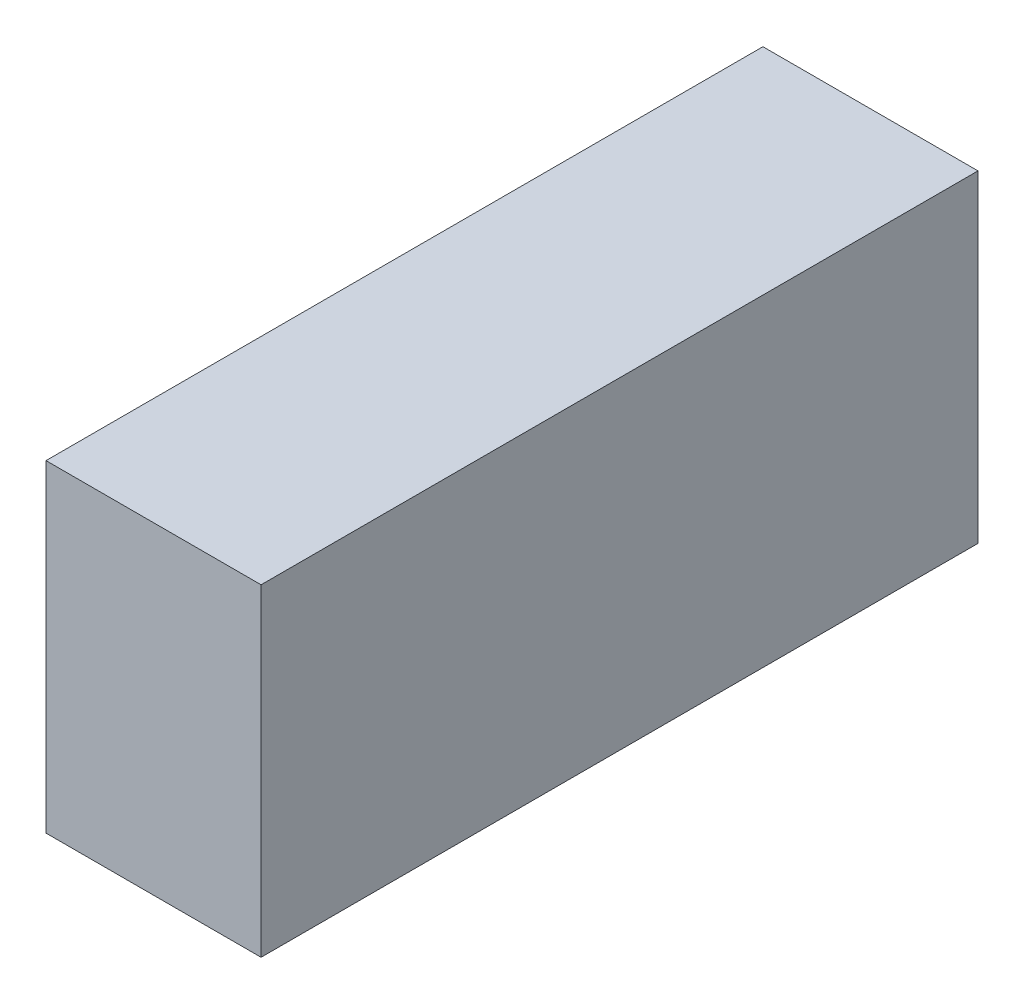
ISO-10303-21;
HEADER;
FILE_DESCRIPTION(('STEP AP214'),'2;1');
FILE_NAME('part.step','',(''),(''),'','','');
FILE_SCHEMA(('AUTOMOTIVE_DESIGN { 1 0 10303 214 1 1 1 1 }'));
ENDSEC;
DATA;
#1=APPLICATION_CONTEXT('core data for automotive mechanical design processes');
#2=APPLICATION_PROTOCOL_DEFINITION('international standard','automotive_design',2000,#1);
#3=PRODUCT_CONTEXT('',#1,'mechanical');
#4=PRODUCT('Part','Part','',(#3));
#5=PRODUCT_RELATED_PRODUCT_CATEGORY('part','',(#4));
#6=PRODUCT_DEFINITION_FORMATION('','',#4);
#7=PRODUCT_DEFINITION_CONTEXT('part definition',#1,'design');
#8=PRODUCT_DEFINITION('design','',#6,#7);
#9=PRODUCT_DEFINITION_SHAPE('','',#8);
#10=(LENGTH_UNIT() NAMED_UNIT(*) SI_UNIT(.MILLI.,.METRE.));
#11=(NAMED_UNIT(*) PLANE_ANGLE_UNIT() SI_UNIT($,.RADIAN.));
#12=(NAMED_UNIT(*) SI_UNIT($,.STERADIAN.) SOLID_ANGLE_UNIT());
#13=UNCERTAINTY_MEASURE_WITH_UNIT(LENGTH_MEASURE(1.E-05),#10,'distance_accuracy_value','');
#14=(GEOMETRIC_REPRESENTATION_CONTEXT(3) GLOBAL_UNCERTAINTY_ASSIGNED_CONTEXT((#13)) GLOBAL_UNIT_ASSIGNED_CONTEXT((#10,
#11,#12)) REPRESENTATION_CONTEXT('',''));
#15=CARTESIAN_POINT('',(0.,0.,0.));
#16=DIRECTION('',(0.,0.,1.));
#17=DIRECTION('',(1.,0.,0.));
#18=AXIS2_PLACEMENT_3D('',#15,#16,#17);
#19=CARTESIAN_POINT('',(3.92803054893306,90.5374568969699,200.));
#20=DIRECTION('',(1.,0.,0.));
#21=DIRECTION('',(0.,0.,-1.));
#22=AXIS2_PLACEMENT_3D('',#19,#20,#21);
#23=PLANE('',#22);
#24=DIRECTION('',(0.,-1.,0.));
#25=VECTOR('',#24,1.);
#26=CARTESIAN_POINT('',(3.92803054893306,90.5374568969699,0.));
#27=LINE('',#26,#25);
#28=CARTESIAN_POINT('',(3.92803054893306,180.53745689697,0.));
#29=VERTEX_POINT('',#28);
#30=CARTESIAN_POINT('',(3.92803054893306,90.5374568969699,0.));
#31=VERTEX_POINT('',#30);
#32=EDGE_CURVE('E95',#29,#31,#27,.T.);
#33=ORIENTED_EDGE('',*,*,#32,.T.);
#34=DIRECTION('',(0.,0.,-1.));
#35=VECTOR('',#34,1.);
#36=CARTESIAN_POINT('',(3.92803054893306,90.5374568969699,200.));
#37=LINE('',#36,#35);
#38=CARTESIAN_POINT('',(3.92803054893306,90.5374568969699,200.));
#39=VERTEX_POINT('',#38);
#40=EDGE_CURVE('E11',#39,#31,#37,.T.);
#41=ORIENTED_EDGE('',*,*,#40,.F.);
#42=DIRECTION('',(0.,-1.,0.));
#43=VECTOR('',#42,1.);
#44=CARTESIAN_POINT('',(3.92803054893306,90.5374568969699,200.));
#45=LINE('',#44,#43);
#46=CARTESIAN_POINT('',(3.92803054893306,180.53745689697,200.));
#47=VERTEX_POINT('',#46);
#48=EDGE_CURVE('E83',#47,#39,#45,.T.);
#49=ORIENTED_EDGE('',*,*,#48,.F.);
#50=DIRECTION('',(0.,0.,-1.));
#51=VECTOR('',#50,1.);
#52=CARTESIAN_POINT('',(3.92803054893306,180.53745689697,200.));
#53=LINE('',#52,#51);
#54=EDGE_CURVE('E91',#47,#29,#53,.T.);
#55=ORIENTED_EDGE('',*,*,#54,.T.);
#56=EDGE_LOOP('',(#33,#41,#49,#55));
#57=FACE_BOUND('',#56,.T.);
#58=ADVANCED_FACE('F32',(#57),#23,.F.);
#59=CARTESIAN_POINT('',(3.92803054893306,90.5374568969699,200.));
#60=DIRECTION('',(0.,1.,0.));
#61=DIRECTION('',(0.,0.,1.));
#62=AXIS2_PLACEMENT_3D('',#59,#60,#61);
#63=PLANE('',#62);
#64=DIRECTION('',(1.,0.,0.));
#65=VECTOR('',#64,1.);
#66=CARTESIAN_POINT('',(3.92803054893306,90.5374568969699,0.));
#67=LINE('',#66,#65);
#68=CARTESIAN_POINT('',(63.9280305489331,90.5374568969699,0.));
#69=VERTEX_POINT('',#68);
#70=EDGE_CURVE('E87',#31,#69,#67,.T.);
#71=ORIENTED_EDGE('',*,*,#70,.T.);
#72=DIRECTION('',(0.,0.,-1.));
#73=VECTOR('',#72,1.);
#74=CARTESIAN_POINT('',(63.9280305489331,90.5374568969699,200.));
#75=LINE('',#74,#73);
#76=CARTESIAN_POINT('',(63.9280305489331,90.5374568969699,200.));
#77=VERTEX_POINT('',#76);
#78=EDGE_CURVE('E40',#77,#69,#75,.T.);
#79=ORIENTED_EDGE('',*,*,#78,.F.);
#80=DIRECTION('',(1.,0.,0.));
#81=VECTOR('',#80,1.);
#82=CARTESIAN_POINT('',(3.92803054893306,90.5374568969699,200.));
#83=LINE('',#82,#81);
#84=EDGE_CURVE('E78',#39,#77,#83,.T.);
#85=ORIENTED_EDGE('',*,*,#84,.F.);
#86=ORIENTED_EDGE('',*,*,#40,.T.);
#87=EDGE_LOOP('',(#71,#79,#85,#86));
#88=FACE_BOUND('',#87,.T.);
#89=ADVANCED_FACE('F86',(#88),#63,.F.);
#90=CARTESIAN_POINT('',(63.9280305489331,90.5374568969699,200.));
#91=DIRECTION('',(-1.,0.,0.));
#92=DIRECTION('',(0.,0.,1.));
#93=AXIS2_PLACEMENT_3D('',#90,#91,#92);
#94=PLANE('',#93);
#95=DIRECTION('',(0.,1.,0.));
#96=VECTOR('',#95,1.);
#97=CARTESIAN_POINT('',(63.9280305489331,90.5374568969699,0.));
#98=LINE('',#97,#96);
#99=CARTESIAN_POINT('',(63.9280305489331,180.53745689697,0.));
#100=VERTEX_POINT('',#99);
#101=EDGE_CURVE('E65',#69,#100,#98,.T.);
#102=ORIENTED_EDGE('',*,*,#101,.T.);
#103=DIRECTION('',(0.,0.,-1.));
#104=VECTOR('',#103,1.);
#105=CARTESIAN_POINT('',(63.9280305489331,180.53745689697,200.));
#106=LINE('',#105,#104);
#107=CARTESIAN_POINT('',(63.9280305489331,180.53745689697,200.));
#108=VERTEX_POINT('',#107);
#109=EDGE_CURVE('E88',#108,#100,#106,.T.);
#110=ORIENTED_EDGE('',*,*,#109,.F.);
#111=DIRECTION('',(0.,1.,0.));
#112=VECTOR('',#111,1.);
#113=CARTESIAN_POINT('',(63.9280305489331,90.5374568969699,200.));
#114=LINE('',#113,#112);
#115=EDGE_CURVE('E81',#77,#108,#114,.T.);
#116=ORIENTED_EDGE('',*,*,#115,.F.);
#117=ORIENTED_EDGE('',*,*,#78,.T.);
#118=EDGE_LOOP('',(#102,#110,#116,#117));
#119=FACE_BOUND('',#118,.T.);
#120=ADVANCED_FACE('F89',(#119),#94,.F.);
#121=CARTESIAN_POINT('',(3.92803054893306,180.53745689697,200.));
#122=DIRECTION('',(0.,-1.,0.));
#123=DIRECTION('',(0.,0.,-1.));
#124=AXIS2_PLACEMENT_3D('',#121,#122,#123);
#125=PLANE('',#124);
#126=DIRECTION('',(-1.,0.,0.));
#127=VECTOR('',#126,1.);
#128=CARTESIAN_POINT('',(3.92803054893306,180.53745689697,0.));
#129=LINE('',#128,#127);
#130=EDGE_CURVE('E71',#100,#29,#129,.T.);
#131=ORIENTED_EDGE('',*,*,#130,.T.);
#132=ORIENTED_EDGE('',*,*,#54,.F.);
#133=DIRECTION('',(-1.,0.,0.));
#134=VECTOR('',#133,1.);
#135=CARTESIAN_POINT('',(3.92803054893306,180.53745689697,200.));
#136=LINE('',#135,#134);
#137=EDGE_CURVE('E48',#108,#47,#136,.T.);
#138=ORIENTED_EDGE('',*,*,#137,.F.);
#139=ORIENTED_EDGE('',*,*,#109,.T.);
#140=EDGE_LOOP('',(#131,#132,#138,#139));
#141=FACE_BOUND('',#140,.T.);
#142=ADVANCED_FACE('F103',(#141),#125,.F.);
#143=CARTESIAN_POINT('',(0.,0.,200.));
#144=DIRECTION('',(0.,0.,-1.));
#145=DIRECTION('',(-1.,0.,0.));
#146=AXIS2_PLACEMENT_3D('',#143,#144,#145);
#147=PLANE('',#146);
#148=ORIENTED_EDGE('',*,*,#48,.T.);
#149=ORIENTED_EDGE('',*,*,#84,.T.);
#150=ORIENTED_EDGE('',*,*,#115,.T.);
#151=ORIENTED_EDGE('',*,*,#137,.T.);
#152=EDGE_LOOP('',(#148,#149,#150,#151));
#153=FACE_BOUND('',#152,.T.);
#154=ADVANCED_FACE('F79',(#153),#147,.F.);
#155=CARTESIAN_POINT('',(0.,0.,0.));
#156=DIRECTION('',(0.,0.,-1.));
#157=DIRECTION('',(-1.,0.,0.));
#158=AXIS2_PLACEMENT_3D('',#155,#156,#157);
#159=PLANE('',#158);
#160=CARTESIAN_POINT('',(57.9280305489331,165.53745689697,0.));
#161=DIRECTION('',(0.,0.,-1.));
#162=DIRECTION('',(-1.,0.,0.));
#163=AXIS2_PLACEMENT_3D('',#160,#161,#162);
#164=CIRCLE('',#163,2.5);
#165=CARTESIAN_POINT('',(55.4280305489331,165.53745689697,0.));
#166=VERTEX_POINT('',#165);
#167=EDGE_CURVE('E115',#166,#166,#164,.T.);
#168=ORIENTED_EDGE('',*,*,#167,.F.);
#169=EDGE_LOOP('',(#168));
#170=FACE_BOUND('',#169,.T.);
#171=CARTESIAN_POINT('',(9.92803054893306,165.53745689697,0.));
#172=DIRECTION('',(0.,0.,-1.));
#173=DIRECTION('',(-1.,0.,0.));
#174=AXIS2_PLACEMENT_3D('',#171,#172,#173);
#175=CIRCLE('',#174,2.5);
#176=CARTESIAN_POINT('',(7.42803054893306,165.53745689697,0.));
#177=VERTEX_POINT('',#176);
#178=EDGE_CURVE('E121',#177,#177,#175,.T.);
#179=ORIENTED_EDGE('',*,*,#178,.F.);
#180=EDGE_LOOP('',(#179));
#181=FACE_BOUND('',#180,.T.);
#182=CARTESIAN_POINT('',(9.92803054893306,105.53745689697,0.));
#183=DIRECTION('',(0.,0.,-1.));
#184=DIRECTION('',(-1.,0.,0.));
#185=AXIS2_PLACEMENT_3D('',#182,#183,#184);
#186=CIRCLE('',#185,2.5);
#187=CARTESIAN_POINT('',(7.42803054893306,105.53745689697,0.));
#188=VERTEX_POINT('',#187);
#189=EDGE_CURVE('E127',#188,#188,#186,.T.);
#190=ORIENTED_EDGE('',*,*,#189,.F.);
#191=EDGE_LOOP('',(#190));
#192=FACE_BOUND('',#191,.T.);
#193=CARTESIAN_POINT('',(57.9280305489331,105.53745689697,0.));
#194=DIRECTION('',(0.,0.,-1.));
#195=DIRECTION('',(-1.,0.,0.));
#196=AXIS2_PLACEMENT_3D('',#193,#194,#195);
#197=CIRCLE('',#196,2.5);
#198=CARTESIAN_POINT('',(55.4280305489331,105.53745689697,0.));
#199=VERTEX_POINT('',#198);
#200=EDGE_CURVE('E109',#199,#199,#197,.T.);
#201=ORIENTED_EDGE('',*,*,#200,.F.);
#202=EDGE_LOOP('',(#201));
#203=FACE_BOUND('',#202,.T.);
#204=ORIENTED_EDGE('',*,*,#32,.F.);
#205=ORIENTED_EDGE('',*,*,#130,.F.);
#206=ORIENTED_EDGE('',*,*,#101,.F.);
#207=ORIENTED_EDGE('',*,*,#70,.F.);
#208=EDGE_LOOP('',(#204,#205,#206,#207));
#209=FACE_BOUND('',#208,.T.);
#210=ADVANCED_FACE('F106',(#170,#181,#192,#203,#209),#159,.T.);
#211=CARTESIAN_POINT('',(57.9280305489331,105.53745689697,10.));
#212=DIRECTION('',(0.,0.,-1.));
#213=DIRECTION('',(-1.,0.,0.));
#214=AXIS2_PLACEMENT_3D('',#211,#212,#213);
#215=CYLINDRICAL_SURFACE('',#214,2.5);
#216=CARTESIAN_POINT('',(57.9280305489331,105.53745689697,10.));
#217=DIRECTION('',(0.,0.,-1.));
#218=DIRECTION('',(-1.,0.,0.));
#219=AXIS2_PLACEMENT_3D('',#216,#217,#218);
#220=CIRCLE('',#219,2.5);
#221=CARTESIAN_POINT('',(55.4280305489331,105.53745689697,10.));
#222=VERTEX_POINT('',#221);
#223=EDGE_CURVE('E98',#222,#222,#220,.T.);
#224=ORIENTED_EDGE('',*,*,#223,.F.);
#225=EDGE_LOOP('',(#224));
#226=FACE_BOUND('',#225,.T.);
#227=ORIENTED_EDGE('',*,*,#200,.T.);
#228=EDGE_LOOP('',(#227));
#229=FACE_BOUND('',#228,.T.);
#230=ADVANCED_FACE('F144',(#226,#229),#215,.F.);
#231=CARTESIAN_POINT('',(57.9280305489331,105.53745689697,10.));
#232=DIRECTION('',(0.,0.,-1.));
#233=DIRECTION('',(-1.,0.,0.));
#234=AXIS2_PLACEMENT_3D('',#231,#232,#233);
#235=PLANE('',#234);
#236=ORIENTED_EDGE('',*,*,#223,.T.);
#237=EDGE_LOOP('',(#236));
#238=FACE_BOUND('',#237,.T.);
#239=ADVANCED_FACE('F138',(#238),#235,.T.);
#240=CARTESIAN_POINT('',(9.92803054893306,105.53745689697,10.));
#241=DIRECTION('',(0.,0.,-1.));
#242=DIRECTION('',(-1.,0.,0.));
#243=AXIS2_PLACEMENT_3D('',#240,#241,#242);
#244=CYLINDRICAL_SURFACE('',#243,2.5);
#245=CARTESIAN_POINT('',(9.92803054893306,105.53745689697,10.));
#246=DIRECTION('',(0.,0.,-1.));
#247=DIRECTION('',(-1.,0.,0.));
#248=AXIS2_PLACEMENT_3D('',#245,#246,#247);
#249=CIRCLE('',#248,2.5);
#250=CARTESIAN_POINT('',(7.42803054893306,105.53745689697,10.));
#251=VERTEX_POINT('',#250);
#252=EDGE_CURVE('E112',#251,#251,#249,.T.);
#253=ORIENTED_EDGE('',*,*,#252,.F.);
#254=EDGE_LOOP('',(#253));
#255=FACE_BOUND('',#254,.T.);
#256=ORIENTED_EDGE('',*,*,#189,.T.);
#257=EDGE_LOOP('',(#256));
#258=FACE_BOUND('',#257,.T.);
#259=ADVANCED_FACE('F135',(#255,#258),#244,.F.);
#260=CARTESIAN_POINT('',(9.92803054893306,105.53745689697,10.));
#261=DIRECTION('',(0.,0.,-1.));
#262=DIRECTION('',(-1.,0.,0.));
#263=AXIS2_PLACEMENT_3D('',#260,#261,#262);
#264=PLANE('',#263);
#265=ORIENTED_EDGE('',*,*,#252,.T.);
#266=EDGE_LOOP('',(#265));
#267=FACE_BOUND('',#266,.T.);
#268=ADVANCED_FACE('F133',(#267),#264,.T.);
#269=CARTESIAN_POINT('',(9.92803054893306,165.53745689697,10.));
#270=DIRECTION('',(0.,0.,-1.));
#271=DIRECTION('',(-1.,0.,0.));
#272=AXIS2_PLACEMENT_3D('',#269,#270,#271);
#273=CYLINDRICAL_SURFACE('',#272,2.5);
#274=CARTESIAN_POINT('',(9.92803054893306,165.53745689697,10.));
#275=DIRECTION('',(0.,0.,-1.));
#276=DIRECTION('',(-1.,0.,0.));
#277=AXIS2_PLACEMENT_3D('',#274,#275,#276);
#278=CIRCLE('',#277,2.5);
#279=CARTESIAN_POINT('',(7.42803054893306,165.53745689697,10.));
#280=VERTEX_POINT('',#279);
#281=EDGE_CURVE('E124',#280,#280,#278,.T.);
#282=ORIENTED_EDGE('',*,*,#281,.F.);
#283=EDGE_LOOP('',(#282));
#284=FACE_BOUND('',#283,.T.);
#285=ORIENTED_EDGE('',*,*,#178,.T.);
#286=EDGE_LOOP('',(#285));
#287=FACE_BOUND('',#286,.T.);
#288=ADVANCED_FACE('F203',(#284,#287),#273,.F.);
#289=CARTESIAN_POINT('',(9.92803054893306,165.53745689697,10.));
#290=DIRECTION('',(0.,0.,-1.));
#291=DIRECTION('',(-1.,0.,0.));
#292=AXIS2_PLACEMENT_3D('',#289,#290,#291);
#293=PLANE('',#292);
#294=ORIENTED_EDGE('',*,*,#281,.T.);
#295=EDGE_LOOP('',(#294));
#296=FACE_BOUND('',#295,.T.);
#297=ADVANCED_FACE('F212',(#296),#293,.T.);
#298=CARTESIAN_POINT('',(57.9280305489331,165.53745689697,10.));
#299=DIRECTION('',(0.,0.,-1.));
#300=DIRECTION('',(-1.,0.,0.));
#301=AXIS2_PLACEMENT_3D('',#298,#299,#300);
#302=CYLINDRICAL_SURFACE('',#301,2.5);
#303=CARTESIAN_POINT('',(57.9280305489331,165.53745689697,10.));
#304=DIRECTION('',(0.,0.,-1.));
#305=DIRECTION('',(-1.,0.,0.));
#306=AXIS2_PLACEMENT_3D('',#303,#304,#305);
#307=CIRCLE('',#306,2.5);
#308=CARTESIAN_POINT('',(55.4280305489331,165.53745689697,10.));
#309=VERTEX_POINT('',#308);
#310=EDGE_CURVE('E118',#309,#309,#307,.T.);
#311=ORIENTED_EDGE('',*,*,#310,.F.);
#312=EDGE_LOOP('',(#311));
#313=FACE_BOUND('',#312,.T.);
#314=ORIENTED_EDGE('',*,*,#167,.T.);
#315=EDGE_LOOP('',(#314));
#316=FACE_BOUND('',#315,.T.);
#317=ADVANCED_FACE('F222',(#313,#316),#302,.F.);
#318=CARTESIAN_POINT('',(57.9280305489331,165.53745689697,10.));
#319=DIRECTION('',(0.,0.,-1.));
#320=DIRECTION('',(-1.,0.,0.));
#321=AXIS2_PLACEMENT_3D('',#318,#319,#320);
#322=PLANE('',#321);
#323=ORIENTED_EDGE('',*,*,#310,.T.);
#324=EDGE_LOOP('',(#323));
#325=FACE_BOUND('',#324,.T.);
#326=ADVANCED_FACE('F232',(#325),#322,.T.);
#327=CLOSED_SHELL('',(#58,#89,#120,#142,#154,#210,#230,#239,#259,#268,#288,#297,#317,#326));
#328=MANIFOLD_SOLID_BREP('B2',#327);
#329=ADVANCED_BREP_SHAPE_REPRESENTATION('',(#18,#328),#14);
#330=SHAPE_DEFINITION_REPRESENTATION(#9,#329);
ENDSEC;
END-ISO-10303-21;
